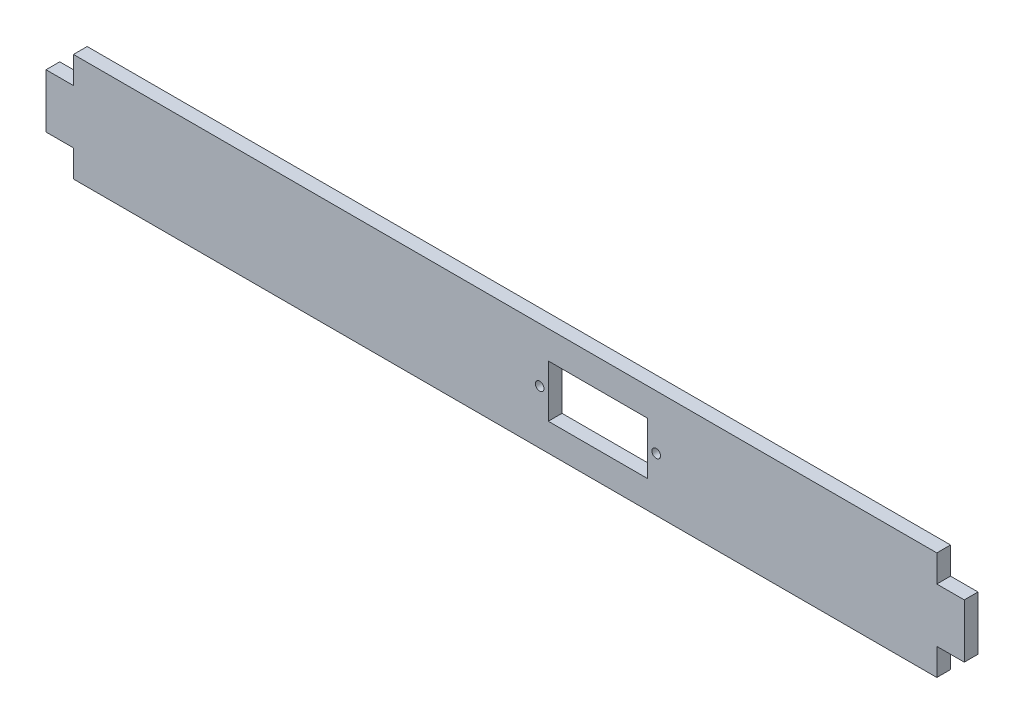
ISO-10303-21;
HEADER;
FILE_DESCRIPTION(('STEP AP214'),'2;1');
FILE_NAME('part.step','',(''),(''),'','','');
FILE_SCHEMA(('AUTOMOTIVE_DESIGN { 1 0 10303 214 1 1 1 1 }'));
ENDSEC;
DATA;
#1=APPLICATION_CONTEXT('core data for automotive mechanical design processes');
#2=APPLICATION_PROTOCOL_DEFINITION('international standard','automotive_design',2000,#1);
#3=PRODUCT_CONTEXT('',#1,'mechanical');
#4=PRODUCT('Part','Part','',(#3));
#5=PRODUCT_RELATED_PRODUCT_CATEGORY('part','',(#4));
#6=PRODUCT_DEFINITION_FORMATION('','',#4);
#7=PRODUCT_DEFINITION_CONTEXT('part definition',#1,'design');
#8=PRODUCT_DEFINITION('design','',#6,#7);
#9=PRODUCT_DEFINITION_SHAPE('','',#8);
#10=(LENGTH_UNIT() NAMED_UNIT(*) SI_UNIT(.MILLI.,.METRE.));
#11=(NAMED_UNIT(*) PLANE_ANGLE_UNIT() SI_UNIT($,.RADIAN.));
#12=(NAMED_UNIT(*) SI_UNIT($,.STERADIAN.) SOLID_ANGLE_UNIT());
#13=UNCERTAINTY_MEASURE_WITH_UNIT(LENGTH_MEASURE(1.E-05),#10,'distance_accuracy_value','');
#14=(GEOMETRIC_REPRESENTATION_CONTEXT(3) GLOBAL_UNCERTAINTY_ASSIGNED_CONTEXT((#13)) GLOBAL_UNIT_ASSIGNED_CONTEXT((#10,
#11,#12)) REPRESENTATION_CONTEXT('',''));
#15=CARTESIAN_POINT('',(0.,0.,0.));
#16=DIRECTION('',(0.,0.,1.));
#17=DIRECTION('',(1.,0.,0.));
#18=AXIS2_PLACEMENT_3D('',#15,#16,#17);
#19=CARTESIAN_POINT('',(0.,0.,1.59));
#20=DIRECTION('',(1.,0.,0.));
#21=DIRECTION('',(0.,0.,-1.));
#22=AXIS2_PLACEMENT_3D('',#19,#20,#21);
#23=PLANE('',#22);
#24=DIRECTION('',(0.,0.,-1.));
#25=VECTOR('',#24,1.);
#26=CARTESIAN_POINT('',(0.,18.75,1.59));
#27=LINE('',#26,#25);
#28=CARTESIAN_POINT('',(0.,18.75,1.59));
#29=VERTEX_POINT('',#28);
#30=CARTESIAN_POINT('',(0.,18.75,-1.59));
#31=VERTEX_POINT('',#30);
#32=EDGE_CURVE('E517',#29,#31,#27,.T.);
#33=ORIENTED_EDGE('',*,*,#32,.F.);
#34=DIRECTION('',(0.,-1.,0.));
#35=VECTOR('',#34,1.);
#36=CARTESIAN_POINT('',(0.,0.,1.59));
#37=LINE('',#36,#35);
#38=CARTESIAN_POINT('',(0.,25.,1.59));
#39=VERTEX_POINT('',#38);
#40=EDGE_CURVE('E176',#39,#29,#37,.T.);
#41=ORIENTED_EDGE('',*,*,#40,.F.);
#42=DIRECTION('',(0.,0.,-1.));
#43=VECTOR('',#42,1.);
#44=CARTESIAN_POINT('',(0.,25.,1.59));
#45=LINE('',#44,#43);
#46=CARTESIAN_POINT('',(0.,25.,-1.59));
#47=VERTEX_POINT('',#46);
#48=EDGE_CURVE('E198',#39,#47,#45,.T.);
#49=ORIENTED_EDGE('',*,*,#48,.T.);
#50=DIRECTION('',(0.,-1.,0.));
#51=VECTOR('',#50,1.);
#52=CARTESIAN_POINT('',(0.,0.,-1.59));
#53=LINE('',#52,#51);
#54=EDGE_CURVE('E199',#47,#31,#53,.T.);
#55=ORIENTED_EDGE('',*,*,#54,.T.);
#56=EDGE_LOOP('',(#33,#41,#49,#55));
#57=FACE_BOUND('',#56,.T.);
#58=ADVANCED_FACE('F39',(#57),#23,.F.);
#59=CARTESIAN_POINT('',(200.,0.,1.59));
#60=DIRECTION('',(-1.,0.,0.));
#61=DIRECTION('',(0.,0.,1.));
#62=AXIS2_PLACEMENT_3D('',#59,#60,#61);
#63=PLANE('',#62);
#64=DIRECTION('',(0.,0.,-1.));
#65=VECTOR('',#64,1.);
#66=CARTESIAN_POINT('',(200.,6.24999999999998,1.59));
#67=LINE('',#66,#65);
#68=CARTESIAN_POINT('',(200.,6.24999999999998,1.59));
#69=VERTEX_POINT('',#68);
#70=CARTESIAN_POINT('',(200.,6.24999999999998,-1.59));
#71=VERTEX_POINT('',#70);
#72=EDGE_CURVE('E248',#69,#71,#67,.T.);
#73=ORIENTED_EDGE('',*,*,#72,.F.);
#74=DIRECTION('',(0.,1.,0.));
#75=VECTOR('',#74,1.);
#76=CARTESIAN_POINT('',(200.,0.,1.59));
#77=LINE('',#76,#75);
#78=CARTESIAN_POINT('',(200.,0.,1.59));
#79=VERTEX_POINT('',#78);
#80=EDGE_CURVE('E191',#79,#69,#77,.T.);
#81=ORIENTED_EDGE('',*,*,#80,.F.);
#82=DIRECTION('',(0.,0.,-1.));
#83=VECTOR('',#82,1.);
#84=CARTESIAN_POINT('',(200.,0.,1.59));
#85=LINE('',#84,#83);
#86=CARTESIAN_POINT('',(200.,0.,-1.59));
#87=VERTEX_POINT('',#86);
#88=EDGE_CURVE('E48',#79,#87,#85,.T.);
#89=ORIENTED_EDGE('',*,*,#88,.T.);
#90=DIRECTION('',(0.,1.,0.));
#91=VECTOR('',#90,1.);
#92=CARTESIAN_POINT('',(200.,0.,-1.59));
#93=LINE('',#92,#91);
#94=EDGE_CURVE('E182',#87,#71,#93,.T.);
#95=ORIENTED_EDGE('',*,*,#94,.T.);
#96=EDGE_LOOP('',(#73,#81,#89,#95));
#97=FACE_BOUND('',#96,.T.);
#98=ADVANCED_FACE('F224',(#97),#63,.F.);
#99=CARTESIAN_POINT('',(0.,6.24999999999998,1.59));
#100=VERTEX_POINT('',#99);
#101=CARTESIAN_POINT('',(0.,0.,1.59));
#102=VERTEX_POINT('',#101);
#103=EDGE_CURVE('E166',#100,#102,#37,.T.);
#104=ORIENTED_EDGE('',*,*,#103,.F.);
#105=DIRECTION('',(0.,0.,-1.));
#106=VECTOR('',#105,1.);
#107=CARTESIAN_POINT('',(0.,6.24999999999998,1.59));
#108=LINE('',#107,#106);
#109=CARTESIAN_POINT('',(0.,6.24999999999998,-1.59));
#110=VERTEX_POINT('',#109);
#111=EDGE_CURVE('E151',#100,#110,#108,.T.);
#112=ORIENTED_EDGE('',*,*,#111,.T.);
#113=CARTESIAN_POINT('',(0.,0.,-1.59));
#114=VERTEX_POINT('',#113);
#115=EDGE_CURVE('E204',#110,#114,#53,.T.);
#116=ORIENTED_EDGE('',*,*,#115,.T.);
#117=DIRECTION('',(0.,0.,-1.));
#118=VECTOR('',#117,1.);
#119=CARTESIAN_POINT('',(0.,0.,1.59));
#120=LINE('',#119,#118);
#121=EDGE_CURVE('E11',#102,#114,#120,.T.);
#122=ORIENTED_EDGE('',*,*,#121,.F.);
#123=EDGE_LOOP('',(#104,#112,#116,#122));
#124=FACE_BOUND('',#123,.T.);
#125=ADVANCED_FACE('F41',(#124),#23,.F.);
#126=CARTESIAN_POINT('',(0.,0.,1.59));
#127=DIRECTION('',(0.,1.,0.));
#128=DIRECTION('',(0.,0.,1.));
#129=AXIS2_PLACEMENT_3D('',#126,#127,#128);
#130=PLANE('',#129);
#131=DIRECTION('',(1.,0.,0.));
#132=VECTOR('',#131,1.);
#133=CARTESIAN_POINT('',(0.,0.,-1.59));
#134=LINE('',#133,#132);
#135=EDGE_CURVE('E203',#114,#87,#134,.T.);
#136=ORIENTED_EDGE('',*,*,#135,.T.);
#137=ORIENTED_EDGE('',*,*,#88,.F.);
#138=DIRECTION('',(1.,0.,0.));
#139=VECTOR('',#138,1.);
#140=CARTESIAN_POINT('',(0.,0.,1.59));
#141=LINE('',#140,#139);
#142=EDGE_CURVE('E181',#102,#79,#141,.T.);
#143=ORIENTED_EDGE('',*,*,#142,.F.);
#144=ORIENTED_EDGE('',*,*,#121,.T.);
#145=EDGE_LOOP('',(#136,#137,#143,#144));
#146=FACE_BOUND('',#145,.T.);
#147=ADVANCED_FACE('F355',(#146),#130,.F.);
#148=CARTESIAN_POINT('',(200.,18.75,1.59));
#149=VERTEX_POINT('',#148);
#150=CARTESIAN_POINT('',(200.,25.,1.59));
#151=VERTEX_POINT('',#150);
#152=EDGE_CURVE('E190',#149,#151,#77,.T.);
#153=ORIENTED_EDGE('',*,*,#152,.F.);
#154=DIRECTION('',(0.,0.,-1.));
#155=VECTOR('',#154,1.);
#156=CARTESIAN_POINT('',(200.,18.75,1.59));
#157=LINE('',#156,#155);
#158=CARTESIAN_POINT('',(200.,18.75,-1.59));
#159=VERTEX_POINT('',#158);
#160=EDGE_CURVE('E258',#149,#159,#157,.T.);
#161=ORIENTED_EDGE('',*,*,#160,.T.);
#162=CARTESIAN_POINT('',(200.,25.,-1.59));
#163=VERTEX_POINT('',#162);
#164=EDGE_CURVE('E207',#159,#163,#93,.T.);
#165=ORIENTED_EDGE('',*,*,#164,.T.);
#166=DIRECTION('',(0.,0.,-1.));
#167=VECTOR('',#166,1.);
#168=CARTESIAN_POINT('',(200.,25.,1.59));
#169=LINE('',#168,#167);
#170=EDGE_CURVE('E214',#151,#163,#169,.T.);
#171=ORIENTED_EDGE('',*,*,#170,.F.);
#172=EDGE_LOOP('',(#153,#161,#165,#171));
#173=FACE_BOUND('',#172,.T.);
#174=ADVANCED_FACE('F352',(#173),#63,.F.);
#175=CARTESIAN_POINT('',(0.,25.,1.59));
#176=DIRECTION('',(0.,-1.,0.));
#177=DIRECTION('',(0.,0.,-1.));
#178=AXIS2_PLACEMENT_3D('',#175,#176,#177);
#179=PLANE('',#178);
#180=DIRECTION('',(-1.,0.,0.));
#181=VECTOR('',#180,1.);
#182=CARTESIAN_POINT('',(0.,25.,-1.59));
#183=LINE('',#182,#181);
#184=EDGE_CURVE('E177',#163,#47,#183,.T.);
#185=ORIENTED_EDGE('',*,*,#184,.T.);
#186=ORIENTED_EDGE('',*,*,#48,.F.);
#187=DIRECTION('',(-1.,0.,0.));
#188=VECTOR('',#187,1.);
#189=CARTESIAN_POINT('',(0.,25.,1.59));
#190=LINE('',#189,#188);
#191=EDGE_CURVE('E195',#151,#39,#190,.T.);
#192=ORIENTED_EDGE('',*,*,#191,.F.);
#193=ORIENTED_EDGE('',*,*,#170,.T.);
#194=EDGE_LOOP('',(#185,#186,#192,#193));
#195=FACE_BOUND('',#194,.T.);
#196=ADVANCED_FACE('F362',(#195),#179,.F.);
#197=CARTESIAN_POINT('',(0.,0.,1.59));
#198=DIRECTION('',(0.,0.,-1.));
#199=DIRECTION('',(-1.,0.,0.));
#200=AXIS2_PLACEMENT_3D('',#197,#198,#199);
#201=PLANE('',#200);
#202=CARTESIAN_POINT('',(108.,12.4575460725061,1.59));
#203=DIRECTION('',(0.,0.,-1.));
#204=DIRECTION('',(1.,0.,0.));
#205=AXIS2_PLACEMENT_3D('',#202,#203,#204);
#206=CIRCLE('',#205,0.999999999999998);
#207=CARTESIAN_POINT('',(107.,12.4575460725061,1.59));
#208=VERTEX_POINT('',#207);
#209=EDGE_CURVE('E271',#208,#208,#206,.T.);
#210=ORIENTED_EDGE('',*,*,#209,.T.);
#211=EDGE_LOOP('',(#210));
#212=FACE_BOUND('',#211,.T.);
#213=CARTESIAN_POINT('',(135.,12.4575460725061,1.59));
#214=DIRECTION('',(0.,0.,-1.));
#215=DIRECTION('',(-1.,0.,0.));
#216=AXIS2_PLACEMENT_3D('',#213,#214,#215);
#217=CIRCLE('',#216,0.999999999999998);
#218=CARTESIAN_POINT('',(134.,12.4575460725061,1.59));
#219=VERTEX_POINT('',#218);
#220=EDGE_CURVE('E262',#219,#219,#217,.T.);
#221=ORIENTED_EDGE('',*,*,#220,.T.);
#222=EDGE_LOOP('',(#221));
#223=FACE_BOUND('',#222,.T.);
#224=DIRECTION('',(1.,0.,0.));
#225=VECTOR('',#224,1.);
#226=CARTESIAN_POINT('',(133.,18.5075460725061,1.59));
#227=LINE('',#226,#225);
#228=CARTESIAN_POINT('',(110.,18.5075460725061,1.59));
#229=VERTEX_POINT('',#228);
#230=CARTESIAN_POINT('',(133.,18.5075460725061,1.59));
#231=VERTEX_POINT('',#230);
#232=EDGE_CURVE('E291',#229,#231,#227,.T.);
#233=ORIENTED_EDGE('',*,*,#232,.T.);
#234=DIRECTION('',(0.,-1.,0.));
#235=VECTOR('',#234,1.);
#236=CARTESIAN_POINT('',(133.,18.5075460725061,1.59));
#237=LINE('',#236,#235);
#238=CARTESIAN_POINT('',(133.,6.40754607250605,1.59));
#239=VERTEX_POINT('',#238);
#240=EDGE_CURVE('E278',#231,#239,#237,.T.);
#241=ORIENTED_EDGE('',*,*,#240,.T.);
#242=DIRECTION('',(-1.,0.,0.));
#243=VECTOR('',#242,1.);
#244=CARTESIAN_POINT('',(133.,6.40754607250605,1.59));
#245=LINE('',#244,#243);
#246=CARTESIAN_POINT('',(110.,6.40754607250605,1.59));
#247=VERTEX_POINT('',#246);
#248=EDGE_CURVE('E282',#239,#247,#245,.T.);
#249=ORIENTED_EDGE('',*,*,#248,.T.);
#250=DIRECTION('',(0.,1.,0.));
#251=VECTOR('',#250,1.);
#252=CARTESIAN_POINT('',(110.,18.5075460725061,1.59));
#253=LINE('',#252,#251);
#254=EDGE_CURVE('E287',#247,#229,#253,.T.);
#255=ORIENTED_EDGE('',*,*,#254,.T.);
#256=EDGE_LOOP('',(#233,#241,#249,#255));
#257=FACE_BOUND('',#256,.T.);
#258=ORIENTED_EDGE('',*,*,#40,.T.);
#259=DIRECTION('',(1.,0.,0.));
#260=VECTOR('',#259,1.);
#261=CARTESIAN_POINT('',(0.,18.75,1.59));
#262=LINE('',#261,#260);
#263=CARTESIAN_POINT('',(-6.36,18.75,1.59));
#264=VERTEX_POINT('',#263);
#265=EDGE_CURVE('E160',#264,#29,#262,.T.);
#266=ORIENTED_EDGE('',*,*,#265,.F.);
#267=DIRECTION('',(0.,1.,0.));
#268=VECTOR('',#267,1.);
#269=CARTESIAN_POINT('',(-6.36,18.75,1.59));
#270=LINE('',#269,#268);
#271=CARTESIAN_POINT('',(-6.36000000000001,6.24999999999999,1.59));
#272=VERTEX_POINT('',#271);
#273=EDGE_CURVE('E170',#272,#264,#270,.T.);
#274=ORIENTED_EDGE('',*,*,#273,.F.);
#275=DIRECTION('',(-1.,0.,0.));
#276=VECTOR('',#275,1.);
#277=CARTESIAN_POINT('',(0.,6.24999999999998,1.59));
#278=LINE('',#277,#276);
#279=EDGE_CURVE('E154',#100,#272,#278,.T.);
#280=ORIENTED_EDGE('',*,*,#279,.F.);
#281=ORIENTED_EDGE('',*,*,#103,.T.);
#282=ORIENTED_EDGE('',*,*,#142,.T.);
#283=ORIENTED_EDGE('',*,*,#80,.T.);
#284=DIRECTION('',(-1.,0.,0.));
#285=VECTOR('',#284,1.);
#286=CARTESIAN_POINT('',(200.,6.24999999999998,1.59));
#287=LINE('',#286,#285);
#288=CARTESIAN_POINT('',(206.36,6.24999999999998,1.59));
#289=VERTEX_POINT('',#288);
#290=EDGE_CURVE('E261',#289,#69,#287,.T.);
#291=ORIENTED_EDGE('',*,*,#290,.F.);
#292=DIRECTION('',(0.,-1.,0.));
#293=VECTOR('',#292,1.);
#294=CARTESIAN_POINT('',(206.36,18.75,1.59));
#295=LINE('',#294,#293);
#296=CARTESIAN_POINT('',(206.36,18.75,1.59));
#297=VERTEX_POINT('',#296);
#298=EDGE_CURVE('E243',#297,#289,#295,.T.);
#299=ORIENTED_EDGE('',*,*,#298,.F.);
#300=DIRECTION('',(1.,0.,0.));
#301=VECTOR('',#300,1.);
#302=CARTESIAN_POINT('',(200.,18.75,1.59));
#303=LINE('',#302,#301);
#304=EDGE_CURVE('E238',#149,#297,#303,.T.);
#305=ORIENTED_EDGE('',*,*,#304,.F.);
#306=ORIENTED_EDGE('',*,*,#152,.T.);
#307=ORIENTED_EDGE('',*,*,#191,.T.);
#308=EDGE_LOOP('',(#258,#266,#274,#280,#281,#282,#283,#291,#299,#305,#306,#307));
#309=FACE_BOUND('',#308,.T.);
#310=ADVANCED_FACE('F165',(#212,#223,#257,#309),#201,.F.);
#311=CARTESIAN_POINT('',(0.,0.,-1.59));
#312=DIRECTION('',(0.,0.,-1.));
#313=DIRECTION('',(-1.,0.,0.));
#314=AXIS2_PLACEMENT_3D('',#311,#312,#313);
#315=PLANE('',#314);
#316=CARTESIAN_POINT('',(108.,12.4575460725061,-1.59));
#317=DIRECTION('',(0.,0.,-1.));
#318=DIRECTION('',(1.,0.,0.));
#319=AXIS2_PLACEMENT_3D('',#316,#317,#318);
#320=CIRCLE('',#319,0.999999999999998);
#321=CARTESIAN_POINT('',(107.,12.4575460725061,-1.59));
#322=VERTEX_POINT('',#321);
#323=EDGE_CURVE('E251',#322,#322,#320,.T.);
#324=ORIENTED_EDGE('',*,*,#323,.F.);
#325=EDGE_LOOP('',(#324));
#326=FACE_BOUND('',#325,.T.);
#327=CARTESIAN_POINT('',(135.,12.4575460725061,-1.59));
#328=DIRECTION('',(0.,0.,-1.));
#329=DIRECTION('',(-1.,0.,0.));
#330=AXIS2_PLACEMENT_3D('',#327,#328,#329);
#331=CIRCLE('',#330,0.999999999999998);
#332=CARTESIAN_POINT('',(134.,12.4575460725061,-1.59));
#333=VERTEX_POINT('',#332);
#334=EDGE_CURVE('E267',#333,#333,#331,.T.);
#335=ORIENTED_EDGE('',*,*,#334,.F.);
#336=EDGE_LOOP('',(#335));
#337=FACE_BOUND('',#336,.T.);
#338=DIRECTION('',(0.,-1.,0.));
#339=VECTOR('',#338,1.);
#340=CARTESIAN_POINT('',(133.,18.5075460725061,-1.59));
#341=LINE('',#340,#339);
#342=CARTESIAN_POINT('',(133.,18.5075460725061,-1.59));
#343=VERTEX_POINT('',#342);
#344=CARTESIAN_POINT('',(133.,6.40754607250605,-1.59));
#345=VERTEX_POINT('',#344);
#346=EDGE_CURVE('E266',#343,#345,#341,.T.);
#347=ORIENTED_EDGE('',*,*,#346,.F.);
#348=DIRECTION('',(1.,0.,0.));
#349=VECTOR('',#348,1.);
#350=CARTESIAN_POINT('',(133.,18.5075460725061,-1.59));
#351=LINE('',#350,#349);
#352=CARTESIAN_POINT('',(110.,18.5075460725061,-1.59));
#353=VERTEX_POINT('',#352);
#354=EDGE_CURVE('E283',#353,#343,#351,.T.);
#355=ORIENTED_EDGE('',*,*,#354,.F.);
#356=DIRECTION('',(0.,1.,0.));
#357=VECTOR('',#356,1.);
#358=CARTESIAN_POINT('',(110.,18.5075460725061,-1.59));
#359=LINE('',#358,#357);
#360=CARTESIAN_POINT('',(110.,6.40754607250605,-1.59));
#361=VERTEX_POINT('',#360);
#362=EDGE_CURVE('E301',#361,#353,#359,.T.);
#363=ORIENTED_EDGE('',*,*,#362,.F.);
#364=DIRECTION('',(-1.,0.,0.));
#365=VECTOR('',#364,1.);
#366=CARTESIAN_POINT('',(133.,6.40754607250605,-1.59));
#367=LINE('',#366,#365);
#368=EDGE_CURVE('E297',#345,#361,#367,.T.);
#369=ORIENTED_EDGE('',*,*,#368,.F.);
#370=EDGE_LOOP('',(#347,#355,#363,#369));
#371=FACE_BOUND('',#370,.T.);
#372=ORIENTED_EDGE('',*,*,#54,.F.);
#373=ORIENTED_EDGE('',*,*,#184,.F.);
#374=ORIENTED_EDGE('',*,*,#164,.F.);
#375=DIRECTION('',(1.,0.,0.));
#376=VECTOR('',#375,1.);
#377=CARTESIAN_POINT('',(200.,18.75,-1.59));
#378=LINE('',#377,#376);
#379=CARTESIAN_POINT('',(206.36,18.75,-1.59));
#380=VERTEX_POINT('',#379);
#381=EDGE_CURVE('E63',#159,#380,#378,.T.);
#382=ORIENTED_EDGE('',*,*,#381,.T.);
#383=DIRECTION('',(0.,-1.,0.));
#384=VECTOR('',#383,1.);
#385=CARTESIAN_POINT('',(206.36,18.75,-1.59));
#386=LINE('',#385,#384);
#387=CARTESIAN_POINT('',(206.36,6.24999999999998,-1.59));
#388=VERTEX_POINT('',#387);
#389=EDGE_CURVE('E235',#380,#388,#386,.T.);
#390=ORIENTED_EDGE('',*,*,#389,.T.);
#391=DIRECTION('',(-1.,0.,0.));
#392=VECTOR('',#391,1.);
#393=CARTESIAN_POINT('',(200.,6.24999999999998,-1.59));
#394=LINE('',#393,#392);
#395=EDGE_CURVE('E233',#388,#71,#394,.T.);
#396=ORIENTED_EDGE('',*,*,#395,.T.);
#397=ORIENTED_EDGE('',*,*,#94,.F.);
#398=ORIENTED_EDGE('',*,*,#135,.F.);
#399=ORIENTED_EDGE('',*,*,#115,.F.);
#400=DIRECTION('',(-1.,0.,0.));
#401=VECTOR('',#400,1.);
#402=CARTESIAN_POINT('',(0.,6.24999999999998,-1.59));
#403=LINE('',#402,#401);
#404=CARTESIAN_POINT('',(-6.36000000000001,6.24999999999999,-1.59));
#405=VERTEX_POINT('',#404);
#406=EDGE_CURVE('E55',#110,#405,#403,.T.);
#407=ORIENTED_EDGE('',*,*,#406,.T.);
#408=DIRECTION('',(0.,1.,0.));
#409=VECTOR('',#408,1.);
#410=CARTESIAN_POINT('',(-6.36,18.75,-1.59));
#411=LINE('',#410,#409);
#412=CARTESIAN_POINT('',(-6.36,18.75,-1.59));
#413=VERTEX_POINT('',#412);
#414=EDGE_CURVE('E504',#405,#413,#411,.T.);
#415=ORIENTED_EDGE('',*,*,#414,.T.);
#416=DIRECTION('',(1.,0.,0.));
#417=VECTOR('',#416,1.);
#418=CARTESIAN_POINT('',(0.,18.75,-1.59));
#419=LINE('',#418,#417);
#420=EDGE_CURVE('E172',#413,#31,#419,.T.);
#421=ORIENTED_EDGE('',*,*,#420,.T.);
#422=EDGE_LOOP('',(#372,#373,#374,#382,#390,#396,#397,#398,#399,#407,#415,#421));
#423=FACE_BOUND('',#422,.T.);
#424=ADVANCED_FACE('F230',(#326,#337,#371,#423),#315,.T.);
#425=CARTESIAN_POINT('',(133.,18.5075460725061,1.59));
#426=DIRECTION('',(1.,0.,0.));
#427=DIRECTION('',(0.,0.,-1.));
#428=AXIS2_PLACEMENT_3D('',#425,#426,#427);
#429=PLANE('',#428);
#430=ORIENTED_EDGE('',*,*,#346,.T.);
#431=DIRECTION('',(0.,0.,-1.));
#432=VECTOR('',#431,1.);
#433=CARTESIAN_POINT('',(133.,6.40754607250605,1.59));
#434=LINE('',#433,#432);
#435=EDGE_CURVE('E186',#239,#345,#434,.T.);
#436=ORIENTED_EDGE('',*,*,#435,.F.);
#437=ORIENTED_EDGE('',*,*,#240,.F.);
#438=DIRECTION('',(0.,0.,-1.));
#439=VECTOR('',#438,1.);
#440=CARTESIAN_POINT('',(133.,18.5075460725061,1.59));
#441=LINE('',#440,#439);
#442=EDGE_CURVE('E308',#231,#343,#441,.T.);
#443=ORIENTED_EDGE('',*,*,#442,.T.);
#444=EDGE_LOOP('',(#430,#436,#437,#443));
#445=FACE_BOUND('',#444,.T.);
#446=ADVANCED_FACE('F334',(#445),#429,.F.);
#447=CARTESIAN_POINT('',(133.,18.5075460725061,1.59));
#448=DIRECTION('',(0.,1.,0.));
#449=DIRECTION('',(0.,0.,1.));
#450=AXIS2_PLACEMENT_3D('',#447,#448,#449);
#451=PLANE('',#450);
#452=ORIENTED_EDGE('',*,*,#354,.T.);
#453=ORIENTED_EDGE('',*,*,#442,.F.);
#454=ORIENTED_EDGE('',*,*,#232,.F.);
#455=DIRECTION('',(0.,0.,-1.));
#456=VECTOR('',#455,1.);
#457=CARTESIAN_POINT('',(110.,18.5075460725061,1.59));
#458=LINE('',#457,#456);
#459=EDGE_CURVE('E311',#229,#353,#458,.T.);
#460=ORIENTED_EDGE('',*,*,#459,.T.);
#461=EDGE_LOOP('',(#452,#453,#454,#460));
#462=FACE_BOUND('',#461,.T.);
#463=ADVANCED_FACE('F332',(#462),#451,.F.);
#464=CARTESIAN_POINT('',(110.,18.5075460725061,1.59));
#465=DIRECTION('',(-1.,0.,0.));
#466=DIRECTION('',(0.,-1.,0.));
#467=AXIS2_PLACEMENT_3D('',#464,#465,#466);
#468=PLANE('',#467);
#469=ORIENTED_EDGE('',*,*,#362,.T.);
#470=ORIENTED_EDGE('',*,*,#459,.F.);
#471=ORIENTED_EDGE('',*,*,#254,.F.);
#472=DIRECTION('',(0.,0.,-1.));
#473=VECTOR('',#472,1.);
#474=CARTESIAN_POINT('',(110.,6.40754607250605,1.59));
#475=LINE('',#474,#473);
#476=EDGE_CURVE('E313',#247,#361,#475,.T.);
#477=ORIENTED_EDGE('',*,*,#476,.T.);
#478=EDGE_LOOP('',(#469,#470,#471,#477));
#479=FACE_BOUND('',#478,.T.);
#480=ADVANCED_FACE('F329',(#479),#468,.F.);
#481=CARTESIAN_POINT('',(133.,6.40754607250605,1.59));
#482=DIRECTION('',(0.,-1.,0.));
#483=DIRECTION('',(1.,0.,0.));
#484=AXIS2_PLACEMENT_3D('',#481,#482,#483);
#485=PLANE('',#484);
#486=ORIENTED_EDGE('',*,*,#368,.T.);
#487=ORIENTED_EDGE('',*,*,#476,.F.);
#488=ORIENTED_EDGE('',*,*,#248,.F.);
#489=ORIENTED_EDGE('',*,*,#435,.T.);
#490=EDGE_LOOP('',(#486,#487,#488,#489));
#491=FACE_BOUND('',#490,.T.);
#492=ADVANCED_FACE('F322',(#491),#485,.F.);
#493=CARTESIAN_POINT('',(135.,12.4575460725061,1.59));
#494=DIRECTION('',(0.,0.,-1.));
#495=DIRECTION('',(-1.,0.,0.));
#496=AXIS2_PLACEMENT_3D('',#493,#494,#495);
#497=CYLINDRICAL_SURFACE('',#496,0.999999999999998);
#498=CARTESIAN_POINT('',(134.,12.4575460725061,1.59));
#499=CARTESIAN_POINT('',(134.,12.4575460725061,1.556875));
#500=CARTESIAN_POINT('',(134.,12.4575460725061,1.52375));
#501=CARTESIAN_POINT('',(134.,12.4575460725061,1.4575));
#502=CARTESIAN_POINT('',(134.,12.4575460725061,1.424375));
#503=CARTESIAN_POINT('',(134.,12.4575460725061,1.358125));
#504=CARTESIAN_POINT('',(134.,12.4575460725061,1.325));
#505=CARTESIAN_POINT('',(134.,12.4575460725061,1.25875));
#506=CARTESIAN_POINT('',(134.,12.4575460725061,1.225625));
#507=CARTESIAN_POINT('',(134.,12.4575460725061,1.159375));
#508=CARTESIAN_POINT('',(134.,12.4575460725061,1.12625));
#509=CARTESIAN_POINT('',(134.,12.4575460725061,1.06));
#510=CARTESIAN_POINT('',(134.,12.4575460725061,1.026875));
#511=CARTESIAN_POINT('',(134.,12.4575460725061,0.960625));
#512=CARTESIAN_POINT('',(134.,12.4575460725061,0.9275));
#513=CARTESIAN_POINT('',(134.,12.4575460725061,0.86125));
#514=CARTESIAN_POINT('',(134.,12.4575460725061,0.828125));
#515=CARTESIAN_POINT('',(134.,12.4575460725061,0.761875));
#516=CARTESIAN_POINT('',(134.,12.4575460725061,0.72875));
#517=CARTESIAN_POINT('',(134.,12.4575460725061,0.6625));
#518=CARTESIAN_POINT('',(134.,12.4575460725061,0.629375));
#519=CARTESIAN_POINT('',(134.,12.4575460725061,0.563125));
#520=CARTESIAN_POINT('',(134.,12.4575460725061,0.53));
#521=CARTESIAN_POINT('',(134.,12.4575460725061,0.46375));
#522=CARTESIAN_POINT('',(134.,12.4575460725061,0.430625));
#523=CARTESIAN_POINT('',(134.,12.4575460725061,0.364375));
#524=CARTESIAN_POINT('',(134.,12.4575460725061,0.33125));
#525=CARTESIAN_POINT('',(134.,12.4575460725061,0.265));
#526=CARTESIAN_POINT('',(134.,12.4575460725061,0.231875));
#527=CARTESIAN_POINT('',(134.,12.4575460725061,0.165625));
#528=CARTESIAN_POINT('',(134.,12.4575460725061,0.1325));
#529=CARTESIAN_POINT('',(134.,12.4575460725061,0.0662500000000003));
#530=CARTESIAN_POINT('',(134.,12.4575460725061,0.0331250000000002));
#531=CARTESIAN_POINT('',(134.,12.4575460725061,-0.0331249999999998));
#532=CARTESIAN_POINT('',(134.,12.4575460725061,-0.0662499999999998));
#533=CARTESIAN_POINT('',(134.,12.4575460725061,-0.1325));
#534=CARTESIAN_POINT('',(134.,12.4575460725061,-0.165625));
#535=CARTESIAN_POINT('',(134.,12.4575460725061,-0.231875));
#536=CARTESIAN_POINT('',(134.,12.4575460725061,-0.265));
#537=CARTESIAN_POINT('',(134.,12.4575460725061,-0.33125));
#538=CARTESIAN_POINT('',(134.,12.4575460725061,-0.364375));
#539=CARTESIAN_POINT('',(134.,12.4575460725061,-0.430625));
#540=CARTESIAN_POINT('',(134.,12.4575460725061,-0.46375));
#541=CARTESIAN_POINT('',(134.,12.4575460725061,-0.53));
#542=CARTESIAN_POINT('',(134.,12.4575460725061,-0.563125));
#543=CARTESIAN_POINT('',(134.,12.4575460725061,-0.629375));
#544=CARTESIAN_POINT('',(134.,12.4575460725061,-0.6625));
#545=CARTESIAN_POINT('',(134.,12.4575460725061,-0.72875));
#546=CARTESIAN_POINT('',(134.,12.4575460725061,-0.761875));
#547=CARTESIAN_POINT('',(134.,12.4575460725061,-0.828125));
#548=CARTESIAN_POINT('',(134.,12.4575460725061,-0.86125));
#549=CARTESIAN_POINT('',(134.,12.4575460725061,-0.9275));
#550=CARTESIAN_POINT('',(134.,12.4575460725061,-0.960625));
#551=CARTESIAN_POINT('',(134.,12.4575460725061,-1.026875));
#552=CARTESIAN_POINT('',(134.,12.4575460725061,-1.06));
#553=CARTESIAN_POINT('',(134.,12.4575460725061,-1.12625));
#554=CARTESIAN_POINT('',(134.,12.4575460725061,-1.159375));
#555=CARTESIAN_POINT('',(134.,12.4575460725061,-1.225625));
#556=CARTESIAN_POINT('',(134.,12.4575460725061,-1.25875));
#557=CARTESIAN_POINT('',(134.,12.4575460725061,-1.325));
#558=CARTESIAN_POINT('',(134.,12.4575460725061,-1.358125));
#559=CARTESIAN_POINT('',(134.,12.4575460725061,-1.424375));
#560=CARTESIAN_POINT('',(134.,12.4575460725061,-1.4575));
#561=CARTESIAN_POINT('',(134.,12.4575460725061,-1.52375));
#562=CARTESIAN_POINT('',(134.,12.4575460725061,-1.556875));
#563=CARTESIAN_POINT('',(134.,12.4575460725061,-1.59));
#564=B_SPLINE_CURVE_WITH_KNOTS('',3,(#498,#499,#500,#501,#502,#503,#504,#505,#506,#507,#508,
#509,#510,#511,#512,#513,#514,#515,#516,#517,#518,#519,#520,#521,#522,#523,#524,#525,#526,#527,
#528,#529,#530,#531,#532,#533,#534,#535,#536,#537,#538,#539,#540,#541,#542,#543,#544,#545,#546,
#547,#548,#549,#550,#551,#552,#553,#554,#555,#556,#557,#558,#559,#560,#561,#562,#563),
.UNSPECIFIED.,.F.,.F.,(4,2,2,2,2,2,2,2,2,2,2,2,2,2,2,2,2,2,2,2,2,2,2,2,2,2,2,2,2,2,2,2,4),(0.,
0.0993750000000001,0.19875,0.298125,0.3975,0.496875,0.59625,0.695625,0.795,0.894375,0.99375,
1.093125,1.1925,1.291875,1.39125,1.490625,1.59,1.689375,1.78875,1.888125,1.9875,2.086875,
2.18625,2.285625,2.385,2.484375,2.58375,2.683125,2.7825,2.881875,2.98125,3.080625,3.18),.UNSPECIFIED.);
#565=EDGE_CURVE('BSEAM375',#219,#333,#564,.T.);
#566=ORIENTED_EDGE('',*,*,#220,.F.);
#567=ORIENTED_EDGE('',*,*,#334,.T.);
#568=ORIENTED_EDGE('',*,*,#565,.T.);
#569=ORIENTED_EDGE('',*,*,#565,.F.);
#570=EDGE_LOOP('',(#566,#568,#567,#569));
#571=FACE_BOUND('',#570,.T.);
#572=ADVANCED_FACE('F375',(#571),#497,.F.);
#573=CARTESIAN_POINT('',(108.,12.4575460725061,1.59));
#574=DIRECTION('',(0.,0.,-1.));
#575=DIRECTION('',(-1.,0.,0.));
#576=AXIS2_PLACEMENT_3D('',#573,#574,#575);
#577=CYLINDRICAL_SURFACE('',#576,0.999999999999998);
#578=CARTESIAN_POINT('',(107.,12.4575460725061,1.59));
#579=CARTESIAN_POINT('',(107.,12.4575460725061,1.556875));
#580=CARTESIAN_POINT('',(107.,12.4575460725061,1.52375));
#581=CARTESIAN_POINT('',(107.,12.4575460725061,1.4575));
#582=CARTESIAN_POINT('',(107.,12.4575460725061,1.424375));
#583=CARTESIAN_POINT('',(107.,12.4575460725061,1.358125));
#584=CARTESIAN_POINT('',(107.,12.4575460725061,1.325));
#585=CARTESIAN_POINT('',(107.,12.4575460725061,1.25875));
#586=CARTESIAN_POINT('',(107.,12.4575460725061,1.225625));
#587=CARTESIAN_POINT('',(107.,12.4575460725061,1.159375));
#588=CARTESIAN_POINT('',(107.,12.4575460725061,1.12625));
#589=CARTESIAN_POINT('',(107.,12.4575460725061,1.06));
#590=CARTESIAN_POINT('',(107.,12.4575460725061,1.026875));
#591=CARTESIAN_POINT('',(107.,12.4575460725061,0.960625));
#592=CARTESIAN_POINT('',(107.,12.4575460725061,0.9275));
#593=CARTESIAN_POINT('',(107.,12.4575460725061,0.86125));
#594=CARTESIAN_POINT('',(107.,12.4575460725061,0.828125));
#595=CARTESIAN_POINT('',(107.,12.4575460725061,0.761875));
#596=CARTESIAN_POINT('',(107.,12.4575460725061,0.72875));
#597=CARTESIAN_POINT('',(107.,12.4575460725061,0.6625));
#598=CARTESIAN_POINT('',(107.,12.4575460725061,0.629375));
#599=CARTESIAN_POINT('',(107.,12.4575460725061,0.563125));
#600=CARTESIAN_POINT('',(107.,12.4575460725061,0.53));
#601=CARTESIAN_POINT('',(107.,12.4575460725061,0.46375));
#602=CARTESIAN_POINT('',(107.,12.4575460725061,0.430625));
#603=CARTESIAN_POINT('',(107.,12.4575460725061,0.364375));
#604=CARTESIAN_POINT('',(107.,12.4575460725061,0.33125));
#605=CARTESIAN_POINT('',(107.,12.4575460725061,0.265));
#606=CARTESIAN_POINT('',(107.,12.4575460725061,0.231875));
#607=CARTESIAN_POINT('',(107.,12.4575460725061,0.165625));
#608=CARTESIAN_POINT('',(107.,12.4575460725061,0.1325));
#609=CARTESIAN_POINT('',(107.,12.4575460725061,0.0662500000000003));
#610=CARTESIAN_POINT('',(107.,12.4575460725061,0.0331250000000002));
#611=CARTESIAN_POINT('',(107.,12.4575460725061,-0.0331249999999998));
#612=CARTESIAN_POINT('',(107.,12.4575460725061,-0.0662499999999998));
#613=CARTESIAN_POINT('',(107.,12.4575460725061,-0.1325));
#614=CARTESIAN_POINT('',(107.,12.4575460725061,-0.165625));
#615=CARTESIAN_POINT('',(107.,12.4575460725061,-0.231875));
#616=CARTESIAN_POINT('',(107.,12.4575460725061,-0.265));
#617=CARTESIAN_POINT('',(107.,12.4575460725061,-0.33125));
#618=CARTESIAN_POINT('',(107.,12.4575460725061,-0.364375));
#619=CARTESIAN_POINT('',(107.,12.4575460725061,-0.430625));
#620=CARTESIAN_POINT('',(107.,12.4575460725061,-0.46375));
#621=CARTESIAN_POINT('',(107.,12.4575460725061,-0.53));
#622=CARTESIAN_POINT('',(107.,12.4575460725061,-0.563125));
#623=CARTESIAN_POINT('',(107.,12.4575460725061,-0.629375));
#624=CARTESIAN_POINT('',(107.,12.4575460725061,-0.6625));
#625=CARTESIAN_POINT('',(107.,12.4575460725061,-0.72875));
#626=CARTESIAN_POINT('',(107.,12.4575460725061,-0.761875));
#627=CARTESIAN_POINT('',(107.,12.4575460725061,-0.828125));
#628=CARTESIAN_POINT('',(107.,12.4575460725061,-0.86125));
#629=CARTESIAN_POINT('',(107.,12.4575460725061,-0.9275));
#630=CARTESIAN_POINT('',(107.,12.4575460725061,-0.960625));
#631=CARTESIAN_POINT('',(107.,12.4575460725061,-1.026875));
#632=CARTESIAN_POINT('',(107.,12.4575460725061,-1.06));
#633=CARTESIAN_POINT('',(107.,12.4575460725061,-1.12625));
#634=CARTESIAN_POINT('',(107.,12.4575460725061,-1.159375));
#635=CARTESIAN_POINT('',(107.,12.4575460725061,-1.225625));
#636=CARTESIAN_POINT('',(107.,12.4575460725061,-1.25875));
#637=CARTESIAN_POINT('',(107.,12.4575460725061,-1.325));
#638=CARTESIAN_POINT('',(107.,12.4575460725061,-1.358125));
#639=CARTESIAN_POINT('',(107.,12.4575460725061,-1.424375));
#640=CARTESIAN_POINT('',(107.,12.4575460725061,-1.4575));
#641=CARTESIAN_POINT('',(107.,12.4575460725061,-1.52375));
#642=CARTESIAN_POINT('',(107.,12.4575460725061,-1.556875));
#643=CARTESIAN_POINT('',(107.,12.4575460725061,-1.59));
#644=B_SPLINE_CURVE_WITH_KNOTS('',3,(#578,#579,#580,#581,#582,#583,#584,#585,#586,#587,#588,
#589,#590,#591,#592,#593,#594,#595,#596,#597,#598,#599,#600,#601,#602,#603,#604,#605,#606,#607,
#608,#609,#610,#611,#612,#613,#614,#615,#616,#617,#618,#619,#620,#621,#622,#623,#624,#625,#626,
#627,#628,#629,#630,#631,#632,#633,#634,#635,#636,#637,#638,#639,#640,#641,#642,#643),
.UNSPECIFIED.,.F.,.F.,(4,2,2,2,2,2,2,2,2,2,2,2,2,2,2,2,2,2,2,2,2,2,2,2,2,2,2,2,2,2,2,2,4),(0.,
0.0993750000000001,0.19875,0.298125,0.3975,0.496875,0.59625,0.695625,0.795,0.894375,0.99375,
1.093125,1.1925,1.291875,1.39125,1.490625,1.59,1.689375,1.78875,1.888125,1.9875,2.086875,
2.18625,2.285625,2.385,2.484375,2.58375,2.683125,2.7825,2.881875,2.98125,3.080625,3.18),.UNSPECIFIED.);
#645=EDGE_CURVE('BSEAM378',#208,#322,#644,.T.);
#646=ORIENTED_EDGE('',*,*,#209,.F.);
#647=ORIENTED_EDGE('',*,*,#323,.T.);
#648=ORIENTED_EDGE('',*,*,#645,.T.);
#649=ORIENTED_EDGE('',*,*,#645,.F.);
#650=EDGE_LOOP('',(#646,#648,#647,#649));
#651=FACE_BOUND('',#650,.T.);
#652=ADVANCED_FACE('F378',(#651),#577,.F.);
#653=CARTESIAN_POINT('',(200.,6.24999999999998,1.59));
#654=DIRECTION('',(0.,-1.,0.));
#655=DIRECTION('',(1.,0.,0.));
#656=AXIS2_PLACEMENT_3D('',#653,#654,#655);
#657=PLANE('',#656);
#658=ORIENTED_EDGE('',*,*,#395,.F.);
#659=DIRECTION('',(0.,0.,-1.));
#660=VECTOR('',#659,1.);
#661=CARTESIAN_POINT('',(206.36,6.24999999999998,1.59));
#662=LINE('',#661,#660);
#663=EDGE_CURVE('E252',#289,#388,#662,.T.);
#664=ORIENTED_EDGE('',*,*,#663,.F.);
#665=ORIENTED_EDGE('',*,*,#290,.T.);
#666=ORIENTED_EDGE('',*,*,#72,.T.);
#667=EDGE_LOOP('',(#658,#664,#665,#666));
#668=FACE_BOUND('',#667,.T.);
#669=ADVANCED_FACE('F386',(#668),#657,.T.);
#670=CARTESIAN_POINT('',(206.36,18.75,1.59));
#671=DIRECTION('',(1.,0.,0.));
#672=DIRECTION('',(0.,0.,-1.));
#673=AXIS2_PLACEMENT_3D('',#670,#671,#672);
#674=PLANE('',#673);
#675=ORIENTED_EDGE('',*,*,#389,.F.);
#676=DIRECTION('',(0.,0.,-1.));
#677=VECTOR('',#676,1.);
#678=CARTESIAN_POINT('',(206.36,18.75,1.59));
#679=LINE('',#678,#677);
#680=EDGE_CURVE('E255',#297,#380,#679,.T.);
#681=ORIENTED_EDGE('',*,*,#680,.F.);
#682=ORIENTED_EDGE('',*,*,#298,.T.);
#683=ORIENTED_EDGE('',*,*,#663,.T.);
#684=EDGE_LOOP('',(#675,#681,#682,#683));
#685=FACE_BOUND('',#684,.T.);
#686=ADVANCED_FACE('F455',(#685),#674,.T.);
#687=CARTESIAN_POINT('',(200.,18.75,1.59));
#688=DIRECTION('',(0.,1.,0.));
#689=DIRECTION('',(-1.,0.,0.));
#690=AXIS2_PLACEMENT_3D('',#687,#688,#689);
#691=PLANE('',#690);
#692=ORIENTED_EDGE('',*,*,#381,.F.);
#693=ORIENTED_EDGE('',*,*,#160,.F.);
#694=ORIENTED_EDGE('',*,*,#304,.T.);
#695=ORIENTED_EDGE('',*,*,#680,.T.);
#696=EDGE_LOOP('',(#692,#693,#694,#695));
#697=FACE_BOUND('',#696,.T.);
#698=ADVANCED_FACE('F390',(#697),#691,.T.);
#699=CARTESIAN_POINT('',(0.,18.75,1.59));
#700=DIRECTION('',(0.,1.,0.));
#701=DIRECTION('',(-1.,0.,0.));
#702=AXIS2_PLACEMENT_3D('',#699,#700,#701);
#703=PLANE('',#702);
#704=ORIENTED_EDGE('',*,*,#420,.F.);
#705=DIRECTION('',(0.,0.,-1.));
#706=VECTOR('',#705,1.);
#707=CARTESIAN_POINT('',(-6.36,18.75,1.59));
#708=LINE('',#707,#706);
#709=EDGE_CURVE('E505',#264,#413,#708,.T.);
#710=ORIENTED_EDGE('',*,*,#709,.F.);
#711=ORIENTED_EDGE('',*,*,#265,.T.);
#712=ORIENTED_EDGE('',*,*,#32,.T.);
#713=EDGE_LOOP('',(#704,#710,#711,#712));
#714=FACE_BOUND('',#713,.T.);
#715=ADVANCED_FACE('F472',(#714),#703,.T.);
#716=CARTESIAN_POINT('',(-6.36,18.75,1.59));
#717=DIRECTION('',(-1.,0.,0.));
#718=DIRECTION('',(0.,-1.,0.));
#719=AXIS2_PLACEMENT_3D('',#716,#717,#718);
#720=PLANE('',#719);
#721=ORIENTED_EDGE('',*,*,#414,.F.);
#722=DIRECTION('',(0.,0.,-1.));
#723=VECTOR('',#722,1.);
#724=CARTESIAN_POINT('',(-6.36000000000001,6.24999999999999,1.59));
#725=LINE('',#724,#723);
#726=EDGE_CURVE('E159',#272,#405,#725,.T.);
#727=ORIENTED_EDGE('',*,*,#726,.F.);
#728=ORIENTED_EDGE('',*,*,#273,.T.);
#729=ORIENTED_EDGE('',*,*,#709,.T.);
#730=EDGE_LOOP('',(#721,#727,#728,#729));
#731=FACE_BOUND('',#730,.T.);
#732=ADVANCED_FACE('F480',(#731),#720,.T.);
#733=CARTESIAN_POINT('',(0.,6.24999999999998,1.59));
#734=DIRECTION('',(0.,-1.,0.));
#735=DIRECTION('',(1.,0.,0.));
#736=AXIS2_PLACEMENT_3D('',#733,#734,#735);
#737=PLANE('',#736);
#738=ORIENTED_EDGE('',*,*,#406,.F.);
#739=ORIENTED_EDGE('',*,*,#111,.F.);
#740=ORIENTED_EDGE('',*,*,#279,.T.);
#741=ORIENTED_EDGE('',*,*,#726,.T.);
#742=EDGE_LOOP('',(#738,#739,#740,#741));
#743=FACE_BOUND('',#742,.T.);
#744=ADVANCED_FACE('F153',(#743),#737,.T.);
#745=CLOSED_SHELL('',(#58,#98,#125,#147,#174,#196,#310,#424,#446,#463,#480,#492,#572,#652,#669,
#686,#698,#715,#732,#744));
#746=MANIFOLD_SOLID_BREP('B2',#745);
#747=ADVANCED_BREP_SHAPE_REPRESENTATION('',(#18,#746),#14);
#748=SHAPE_DEFINITION_REPRESENTATION(#9,#747);
ENDSEC;
END-ISO-10303-21;
